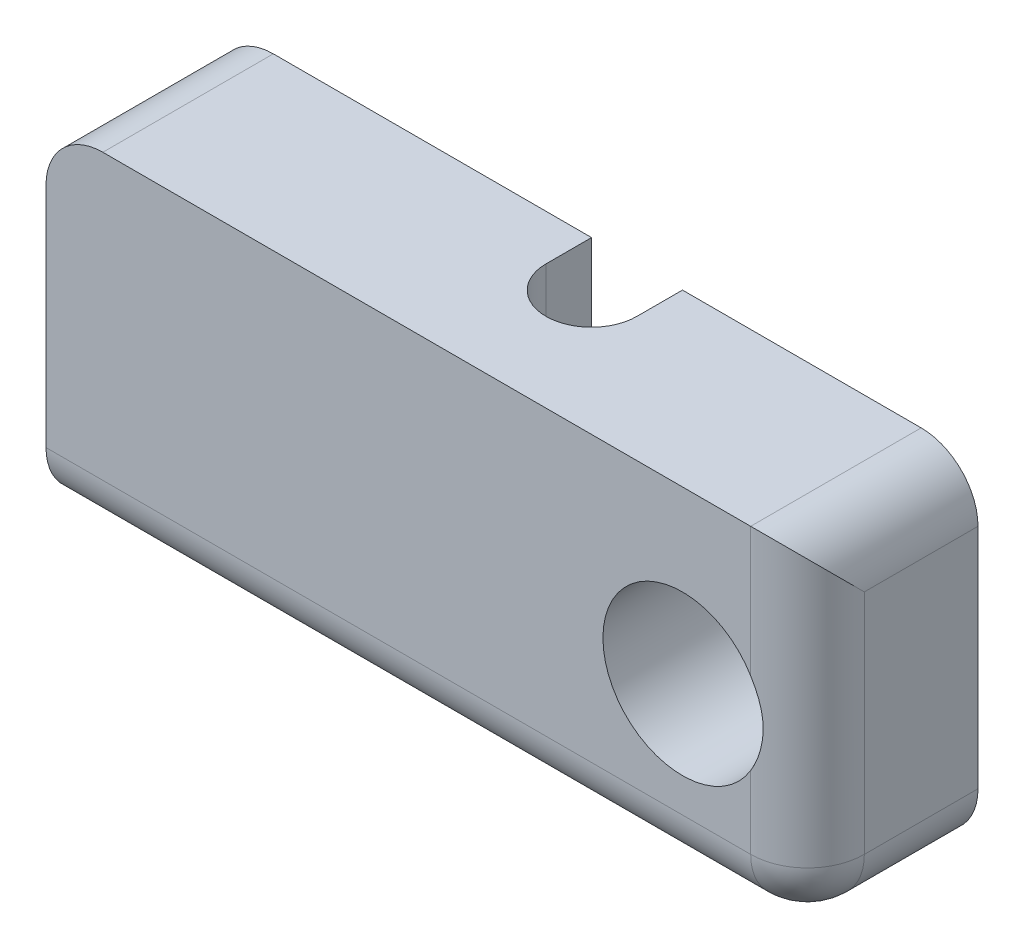
ISO-10303-21;
HEADER;
FILE_DESCRIPTION(('STEP AP214'),'2;1');
FILE_NAME('part.step','',(''),(''),'','','');
FILE_SCHEMA(('AUTOMOTIVE_DESIGN { 1 0 10303 214 1 1 1 1 }'));
ENDSEC;
DATA;
#1=APPLICATION_CONTEXT('core data for automotive mechanical design processes');
#2=APPLICATION_PROTOCOL_DEFINITION('international standard','automotive_design',2000,#1);
#3=PRODUCT_CONTEXT('',#1,'mechanical');
#4=PRODUCT('Part','Part','',(#3));
#5=PRODUCT_RELATED_PRODUCT_CATEGORY('part','',(#4));
#6=PRODUCT_DEFINITION_FORMATION('','',#4);
#7=PRODUCT_DEFINITION_CONTEXT('part definition',#1,'design');
#8=PRODUCT_DEFINITION('design','',#6,#7);
#9=PRODUCT_DEFINITION_SHAPE('','',#8);
#10=(LENGTH_UNIT() NAMED_UNIT(*) SI_UNIT(.MILLI.,.METRE.));
#11=(NAMED_UNIT(*) PLANE_ANGLE_UNIT() SI_UNIT($,.RADIAN.));
#12=(NAMED_UNIT(*) SI_UNIT($,.STERADIAN.) SOLID_ANGLE_UNIT());
#13=UNCERTAINTY_MEASURE_WITH_UNIT(LENGTH_MEASURE(1.E-05),#10,'distance_accuracy_value','');
#14=(GEOMETRIC_REPRESENTATION_CONTEXT(3) GLOBAL_UNCERTAINTY_ASSIGNED_CONTEXT((#13)) GLOBAL_UNIT_ASSIGNED_CONTEXT((#10,
#11,#12)) REPRESENTATION_CONTEXT('',''));
#15=CARTESIAN_POINT('',(0.,0.,0.));
#16=DIRECTION('',(0.,0.,1.));
#17=DIRECTION('',(1.,0.,0.));
#18=AXIS2_PLACEMENT_3D('',#15,#16,#17);
#19=CARTESIAN_POINT('',(-34.2895910701337,-14.94155,3.81));
#20=DIRECTION('',(0.,1.,0.));
#21=DIRECTION('',(0.,0.,1.));
#22=AXIS2_PLACEMENT_3D('',#19,#20,#21);
#23=PLANE('',#22);
#24=DIRECTION('',(0.,0.,-1.));
#25=VECTOR('',#24,1.);
#26=CARTESIAN_POINT('',(-23.8756037701337,-14.94155,0.));
#27=LINE('',#26,#25);
#28=CARTESIAN_POINT('',(-23.8756037701337,-14.94155,1.01854));
#29=VERTEX_POINT('',#28);
#30=CARTESIAN_POINT('',(-23.8756037701337,-14.94155,0.));
#31=VERTEX_POINT('',#30);
#32=EDGE_CURVE('E237',#29,#31,#27,.T.);
#33=ORIENTED_EDGE('',*,*,#32,.T.);
#34=DIRECTION('',(1.,0.,0.));
#35=VECTOR('',#34,1.);
#36=CARTESIAN_POINT('',(-34.2895910701337,-14.94155,0.));
#37=LINE('',#36,#35);
#38=CARTESIAN_POINT('',(-18.5415910701337,-14.94155,0.));
#39=VERTEX_POINT('',#38);
#40=EDGE_CURVE('E175',#31,#39,#37,.T.);
#41=ORIENTED_EDGE('',*,*,#40,.T.);
#42=DIRECTION('',(0.,0.,-1.));
#43=VECTOR('',#42,1.);
#44=CARTESIAN_POINT('',(-18.5415910701337,-14.94155,3.81));
#45=LINE('',#44,#43);
#46=CARTESIAN_POINT('',(-18.5415910701337,-14.94155,2.54));
#47=VERTEX_POINT('',#46);
#48=EDGE_CURVE('E156',#39,#47,#45,.F.);
#49=ORIENTED_EDGE('',*,*,#48,.T.);
#50=DIRECTION('',(1.,0.,0.));
#51=VECTOR('',#50,1.);
#52=CARTESIAN_POINT('',(-34.2895910701337,-14.94155,2.54));
#53=LINE('',#52,#51);
#54=CARTESIAN_POINT('',(-34.2895910701337,-14.94155,2.54));
#55=VERTEX_POINT('',#54);
#56=EDGE_CURVE('E158',#47,#55,#53,.F.);
#57=ORIENTED_EDGE('',*,*,#56,.T.);
#58=DIRECTION('',(0.,0.,-1.));
#59=VECTOR('',#58,1.);
#60=CARTESIAN_POINT('',(-34.2895910701337,-14.94155,3.81));
#61=LINE('',#60,#59);
#62=CARTESIAN_POINT('',(-34.2895910701337,-14.94155,0.));
#63=VERTEX_POINT('',#62);
#64=EDGE_CURVE('E197',#55,#63,#61,.T.);
#65=ORIENTED_EDGE('',*,*,#64,.T.);
#66=CARTESIAN_POINT('',(-25.9075783701337,-14.94155,0.));
#67=VERTEX_POINT('',#66);
#68=EDGE_CURVE('E182',#63,#67,#37,.T.);
#69=ORIENTED_EDGE('',*,*,#68,.T.);
#70=DIRECTION('',(0.,0.,-1.));
#71=VECTOR('',#70,1.);
#72=CARTESIAN_POINT('',(-25.9075783701337,-14.94155,0.));
#73=LINE('',#72,#71);
#74=CARTESIAN_POINT('',(-25.9075783701337,-14.94155,1.01854));
#75=VERTEX_POINT('',#74);
#76=EDGE_CURVE('E56',#75,#67,#73,.T.);
#77=ORIENTED_EDGE('',*,*,#76,.F.);
#78=CARTESIAN_POINT('',(-24.8915910701337,-14.94155,1.01854));
#79=DIRECTION('',(0.,-1.,0.));
#80=DIRECTION('',(0.,0.,-1.));
#81=AXIS2_PLACEMENT_3D('',#78,#79,#80);
#82=CIRCLE('',#81,1.0159873);
#83=EDGE_CURVE('E239',#29,#75,#82,.T.);
#84=ORIENTED_EDGE('',*,*,#83,.F.);
#85=EDGE_LOOP('',(#33,#41,#49,#57,#65,#69,#77,#84));
#86=FACE_BOUND('',#85,.T.);
#87=ADVANCED_FACE('F32',(#86),#23,.F.);
#88=CARTESIAN_POINT('',(-34.2895910701337,-7.32155000000004,3.81));
#89=DIRECTION('',(0.,-1.,0.));
#90=DIRECTION('',(1.,0.,0.));
#91=AXIS2_PLACEMENT_3D('',#88,#89,#90);
#92=PLANE('',#91);
#93=DIRECTION('',(0.,0.,1.));
#94=VECTOR('',#93,1.);
#95=CARTESIAN_POINT('',(-23.8756037701337,-7.32155000000004,0.));
#96=LINE('',#95,#94);
#97=CARTESIAN_POINT('',(-23.8756037701337,-7.32155000000004,0.));
#98=VERTEX_POINT('',#97);
#99=CARTESIAN_POINT('',(-23.8756037701337,-7.32155000000004,1.01854));
#100=VERTEX_POINT('',#99);
#101=EDGE_CURVE('E241',#98,#100,#96,.T.);
#102=ORIENTED_EDGE('',*,*,#101,.T.);
#103=CARTESIAN_POINT('',(-24.8915910701337,-7.32155000000004,1.01854));
#104=DIRECTION('',(0.,-1.,0.));
#105=DIRECTION('',(1.,0.,0.));
#106=AXIS2_PLACEMENT_3D('',#103,#104,#105);
#107=CIRCLE('',#106,1.0159873);
#108=CARTESIAN_POINT('',(-25.9075783701337,-7.32155000000004,1.01854));
#109=VERTEX_POINT('',#108);
#110=EDGE_CURVE('E166',#109,#100,#107,.F.);
#111=ORIENTED_EDGE('',*,*,#110,.F.);
#112=DIRECTION('',(0.,0.,1.));
#113=VECTOR('',#112,1.);
#114=CARTESIAN_POINT('',(-25.9075783701337,-7.32155000000004,0.));
#115=LINE('',#114,#113);
#116=CARTESIAN_POINT('',(-25.9075783701337,-7.32155000000004,0.));
#117=VERTEX_POINT('',#116);
#118=EDGE_CURVE('E244',#117,#109,#115,.T.);
#119=ORIENTED_EDGE('',*,*,#118,.F.);
#120=DIRECTION('',(-1.,0.,0.));
#121=VECTOR('',#120,1.);
#122=CARTESIAN_POINT('',(-34.2895910701337,-7.32155000000004,0.));
#123=LINE('',#122,#121);
#124=CARTESIAN_POINT('',(-33.0195910701337,-7.32155000000004,0.));
#125=VERTEX_POINT('',#124);
#126=EDGE_CURVE('E192',#117,#125,#123,.T.);
#127=ORIENTED_EDGE('',*,*,#126,.T.);
#128=DIRECTION('',(0.,0.,-1.));
#129=VECTOR('',#128,1.);
#130=CARTESIAN_POINT('',(-33.0195910701337,-7.32155000000004,3.81));
#131=LINE('',#130,#129);
#132=CARTESIAN_POINT('',(-33.0195910701337,-7.32155000000004,3.81));
#133=VERTEX_POINT('',#132);
#134=EDGE_CURVE('E146',#125,#133,#131,.F.);
#135=ORIENTED_EDGE('',*,*,#134,.T.);
#136=DIRECTION('',(-1.,0.,0.));
#137=VECTOR('',#136,1.);
#138=CARTESIAN_POINT('',(-34.2895910701337,-7.32155000000004,3.81));
#139=LINE('',#138,#137);
#140=CARTESIAN_POINT('',(-18.5415910701337,-7.32155000000004,3.81));
#141=VERTEX_POINT('',#140);
#142=EDGE_CURVE('E185',#141,#133,#139,.T.);
#143=ORIENTED_EDGE('',*,*,#142,.F.);
#144=DIRECTION('',(0.,0.,-1.));
#145=VECTOR('',#144,1.);
#146=CARTESIAN_POINT('',(-18.5415910701337,-7.32155000000004,3.81));
#147=LINE('',#146,#145);
#148=CARTESIAN_POINT('',(-18.5415910701337,-7.32155000000004,0.));
#149=VERTEX_POINT('',#148);
#150=EDGE_CURVE('E149',#141,#149,#147,.T.);
#151=ORIENTED_EDGE('',*,*,#150,.T.);
#152=EDGE_CURVE('E193',#149,#98,#123,.T.);
#153=ORIENTED_EDGE('',*,*,#152,.T.);
#154=EDGE_LOOP('',(#102,#111,#119,#127,#135,#143,#151,#153));
#155=FACE_BOUND('',#154,.T.);
#156=ADVANCED_FACE('F214',(#155),#92,.F.);
#157=CARTESIAN_POINT('',(0.,0.,0.));
#158=DIRECTION('',(0.,0.,1.));
#159=DIRECTION('',(1.,0.,0.));
#160=AXIS2_PLACEMENT_3D('',#157,#158,#159);
#161=PLANE('',#160);
#162=CARTESIAN_POINT('',(-20.0655910701337,-11.13155,0.));
#163=DIRECTION('',(0.,0.,1.));
#164=DIRECTION('',(1.,0.,0.));
#165=AXIS2_PLACEMENT_3D('',#162,#163,#164);
#166=CIRCLE('',#165,1.778);
#167=CARTESIAN_POINT('',(-18.2875910701337,-11.13155,0.));
#168=VERTEX_POINT('',#167);
#169=EDGE_CURVE('E140',#168,#168,#166,.F.);
#170=ORIENTED_EDGE('',*,*,#169,.F.);
#171=EDGE_LOOP('',(#170));
#172=FACE_BOUND('',#171,.T.);
#173=DIRECTION('',(0.,-1.,0.));
#174=VECTOR('',#173,1.);
#175=CARTESIAN_POINT('',(-23.8756037701337,-7.32055000000004,0.));
#176=LINE('',#175,#174);
#177=EDGE_CURVE('E222',#98,#31,#176,.T.);
#178=ORIENTED_EDGE('',*,*,#177,.F.);
#179=ORIENTED_EDGE('',*,*,#152,.F.);
#180=CARTESIAN_POINT('',(-18.5415910701337,-8.59155000000004,0.));
#181=DIRECTION('',(0.,0.,1.));
#182=DIRECTION('',(1.,0.,0.));
#183=AXIS2_PLACEMENT_3D('',#180,#181,#182);
#184=CIRCLE('',#183,1.27);
#185=CARTESIAN_POINT('',(-17.2715910701337,-8.59155000000004,0.));
#186=VERTEX_POINT('',#185);
#187=EDGE_CURVE('E203',#149,#186,#184,.F.);
#188=ORIENTED_EDGE('',*,*,#187,.T.);
#189=DIRECTION('',(0.,1.,0.));
#190=VECTOR('',#189,1.);
#191=CARTESIAN_POINT('',(-17.2715910701337,-7.32155000000004,0.));
#192=LINE('',#191,#190);
#193=CARTESIAN_POINT('',(-17.2715910701337,-13.67155,0.));
#194=VERTEX_POINT('',#193);
#195=EDGE_CURVE('E189',#194,#186,#192,.T.);
#196=ORIENTED_EDGE('',*,*,#195,.F.);
#197=CARTESIAN_POINT('',(-18.5415910701337,-13.67155,0.));
#198=DIRECTION('',(0.,0.,1.));
#199=DIRECTION('',(1.,0.,0.));
#200=AXIS2_PLACEMENT_3D('',#197,#198,#199);
#201=CIRCLE('',#200,1.27);
#202=EDGE_CURVE('E205',#194,#39,#201,.F.);
#203=ORIENTED_EDGE('',*,*,#202,.T.);
#204=ORIENTED_EDGE('',*,*,#40,.F.);
#205=EDGE_LOOP('',(#178,#179,#188,#196,#203,#204));
#206=FACE_BOUND('',#205,.T.);
#207=ADVANCED_FACE('F219',(#172,#206),#161,.F.);
#208=CARTESIAN_POINT('',(-34.2895910701337,-7.32155000000004,3.81));
#209=DIRECTION('',(1.,0.,0.));
#210=DIRECTION('',(0.,0.,-1.));
#211=AXIS2_PLACEMENT_3D('',#208,#209,#210);
#212=PLANE('',#211);
#213=DIRECTION('',(0.,-1.,0.));
#214=VECTOR('',#213,1.);
#215=CARTESIAN_POINT('',(-34.2895910701337,-7.32155000000004,3.81));
#216=LINE('',#215,#214);
#217=CARTESIAN_POINT('',(-34.2895910701337,-8.59155000000004,3.81));
#218=VERTEX_POINT('',#217);
#219=CARTESIAN_POINT('',(-34.2895910701337,-13.67155,3.81));
#220=VERTEX_POINT('',#219);
#221=EDGE_CURVE('E196',#218,#220,#216,.T.);
#222=ORIENTED_EDGE('',*,*,#221,.F.);
#223=DIRECTION('',(0.,0.,-1.));
#224=VECTOR('',#223,1.);
#225=CARTESIAN_POINT('',(-34.2895910701337,-8.59155000000004,3.81));
#226=LINE('',#225,#224);
#227=CARTESIAN_POINT('',(-34.2895910701337,-8.59155000000004,0.));
#228=VERTEX_POINT('',#227);
#229=EDGE_CURVE('E201',#218,#228,#226,.T.);
#230=ORIENTED_EDGE('',*,*,#229,.T.);
#231=DIRECTION('',(0.,-1.,0.));
#232=VECTOR('',#231,1.);
#233=CARTESIAN_POINT('',(-34.2895910701337,-7.32155000000004,0.));
#234=LINE('',#233,#232);
#235=EDGE_CURVE('E173',#228,#63,#234,.T.);
#236=ORIENTED_EDGE('',*,*,#235,.T.);
#237=ORIENTED_EDGE('',*,*,#64,.F.);
#238=CARTESIAN_POINT('',(-34.2895910701337,-13.67155,2.54));
#239=DIRECTION('',(1.,0.,0.));
#240=DIRECTION('',(0.,0.,-1.));
#241=AXIS2_PLACEMENT_3D('',#238,#239,#240);
#242=CIRCLE('',#241,1.27);
#243=EDGE_CURVE('E199',#55,#220,#242,.F.);
#244=ORIENTED_EDGE('',*,*,#243,.T.);
#245=EDGE_LOOP('',(#222,#230,#236,#237,#244));
#246=FACE_BOUND('',#245,.T.);
#247=ADVANCED_FACE('F265',(#246),#212,.F.);
#248=CARTESIAN_POINT('',(-17.2715910701337,-7.32155000000004,3.81));
#249=DIRECTION('',(-1.,0.,0.));
#250=DIRECTION('',(0.,0.,1.));
#251=AXIS2_PLACEMENT_3D('',#248,#249,#250);
#252=PLANE('',#251);
#253=DIRECTION('',(0.,1.,0.));
#254=VECTOR('',#253,1.);
#255=CARTESIAN_POINT('',(-17.2715910701337,-14.94155,2.54));
#256=LINE('',#255,#254);
#257=CARTESIAN_POINT('',(-17.2715910701337,-8.59155000000004,2.54));
#258=VERTEX_POINT('',#257);
#259=CARTESIAN_POINT('',(-17.2715910701337,-13.67155,2.54));
#260=VERTEX_POINT('',#259);
#261=EDGE_CURVE('E41',#258,#260,#256,.F.);
#262=ORIENTED_EDGE('',*,*,#261,.T.);
#263=DIRECTION('',(0.,0.,-1.));
#264=VECTOR('',#263,1.);
#265=CARTESIAN_POINT('',(-17.2715910701337,-13.67155,3.81));
#266=LINE('',#265,#264);
#267=EDGE_CURVE('E11',#260,#194,#266,.T.);
#268=ORIENTED_EDGE('',*,*,#267,.T.);
#269=ORIENTED_EDGE('',*,*,#195,.T.);
#270=DIRECTION('',(0.,0.,-1.));
#271=VECTOR('',#270,1.);
#272=CARTESIAN_POINT('',(-17.2715910701337,-8.59155000000004,3.81));
#273=LINE('',#272,#271);
#274=EDGE_CURVE('E160',#186,#258,#273,.F.);
#275=ORIENTED_EDGE('',*,*,#274,.T.);
#276=EDGE_LOOP('',(#262,#268,#269,#275));
#277=FACE_BOUND('',#276,.T.);
#278=ADVANCED_FACE('F225',(#277),#252,.F.);
#279=CARTESIAN_POINT('',(0.,0.,3.81));
#280=DIRECTION('',(0.,0.,1.));
#281=DIRECTION('',(1.,0.,0.));
#282=AXIS2_PLACEMENT_3D('',#279,#280,#281);
#283=PLANE('',#282);
#284=CARTESIAN_POINT('',(-20.0655910701337,-11.13155,3.81));
#285=DIRECTION('',(0.,0.,1.));
#286=DIRECTION('',(1.,0.,0.));
#287=AXIS2_PLACEMENT_3D('',#284,#285,#286);
#288=CIRCLE('',#287,1.778);
#289=CARTESIAN_POINT('',(-18.5415910701337,-10.2157399760321,3.81));
#290=VERTEX_POINT('',#289);
#291=CARTESIAN_POINT('',(-18.5415910701337,-12.0473600239679,3.81));
#292=VERTEX_POINT('',#291);
#293=EDGE_CURVE('E48',#290,#292,#288,.T.);
#294=ORIENTED_EDGE('',*,*,#293,.F.);
#295=DIRECTION('',(0.,1.,0.));
#296=VECTOR('',#295,1.);
#297=CARTESIAN_POINT('',(-18.5415910701337,-7.32155000000004,3.81));
#298=LINE('',#297,#296);
#299=EDGE_CURVE('E136',#290,#141,#298,.T.);
#300=ORIENTED_EDGE('',*,*,#299,.T.);
#301=ORIENTED_EDGE('',*,*,#142,.T.);
#302=CARTESIAN_POINT('',(-33.0195910701337,-8.59155000000004,3.81));
#303=DIRECTION('',(0.,0.,1.));
#304=DIRECTION('',(1.,0.,0.));
#305=AXIS2_PLACEMENT_3D('',#302,#303,#304);
#306=CIRCLE('',#305,1.27);
#307=EDGE_CURVE('E154',#133,#218,#306,.T.);
#308=ORIENTED_EDGE('',*,*,#307,.T.);
#309=ORIENTED_EDGE('',*,*,#221,.T.);
#310=DIRECTION('',(1.,0.,0.));
#311=VECTOR('',#310,1.);
#312=CARTESIAN_POINT('',(-17.2715910701337,-13.67155,3.81));
#313=LINE('',#312,#311);
#314=CARTESIAN_POINT('',(-18.5415910701337,-13.67155,3.81));
#315=VERTEX_POINT('',#314);
#316=EDGE_CURVE('E148',#220,#315,#313,.T.);
#317=ORIENTED_EDGE('',*,*,#316,.T.);
#318=EDGE_CURVE('E139',#315,#292,#298,.T.);
#319=ORIENTED_EDGE('',*,*,#318,.T.);
#320=EDGE_LOOP('',(#294,#300,#301,#308,#309,#317,#319));
#321=FACE_BOUND('',#320,.T.);
#322=ADVANCED_FACE('F134',(#321),#283,.T.);
#323=ORIENTED_EDGE('',*,*,#126,.F.);
#324=DIRECTION('',(0.,-1.,0.));
#325=VECTOR('',#324,1.);
#326=CARTESIAN_POINT('',(-25.9075783701337,-7.32055000000004,0.));
#327=LINE('',#326,#325);
#328=EDGE_CURVE('E251',#117,#67,#327,.T.);
#329=ORIENTED_EDGE('',*,*,#328,.T.);
#330=ORIENTED_EDGE('',*,*,#68,.F.);
#331=ORIENTED_EDGE('',*,*,#235,.F.);
#332=CARTESIAN_POINT('',(-33.0195910701337,-8.59155000000004,0.));
#333=DIRECTION('',(0.,0.,1.));
#334=DIRECTION('',(1.,0.,0.));
#335=AXIS2_PLACEMENT_3D('',#332,#333,#334);
#336=CIRCLE('',#335,1.27);
#337=EDGE_CURVE('E208',#228,#125,#336,.F.);
#338=ORIENTED_EDGE('',*,*,#337,.T.);
#339=EDGE_LOOP('',(#323,#329,#330,#331,#338));
#340=FACE_BOUND('',#339,.T.);
#341=ADVANCED_FACE('F268',(#340),#161,.F.);
#342=CARTESIAN_POINT('',(-33.0195910701337,-8.59155000000004,3.81));
#343=DIRECTION('',(0.,0.,-1.));
#344=DIRECTION('',(-1.,0.,0.));
#345=AXIS2_PLACEMENT_3D('',#342,#343,#344);
#346=CYLINDRICAL_SURFACE('',#345,1.27);
#347=ORIENTED_EDGE('',*,*,#307,.F.);
#348=ORIENTED_EDGE('',*,*,#134,.F.);
#349=ORIENTED_EDGE('',*,*,#337,.F.);
#350=ORIENTED_EDGE('',*,*,#229,.F.);
#351=EDGE_LOOP('',(#347,#348,#349,#350));
#352=FACE_BOUND('',#351,.T.);
#353=ADVANCED_FACE('F264',(#352),#346,.T.);
#354=CARTESIAN_POINT('',(-18.5415910701337,-8.59155000000004,3.81));
#355=DIRECTION('',(0.,0.,-1.));
#356=DIRECTION('',(-1.,0.,0.));
#357=AXIS2_PLACEMENT_3D('',#354,#355,#356);
#358=CYLINDRICAL_SURFACE('',#357,1.27);
#359=ORIENTED_EDGE('',*,*,#187,.F.);
#360=ORIENTED_EDGE('',*,*,#150,.F.);
#361=CARTESIAN_POINT('',(-18.5415910701337,-8.59155000000004,2.54));
#362=DIRECTION('',(0.,0.707106781186547,-0.707106781186547));
#363=DIRECTION('',(0.,-0.707106781186547,-0.707106781186547));
#364=AXIS2_PLACEMENT_3D('',#361,#362,#363);
#365=ELLIPSE('',#364,1.79605122421383,1.27);
#366=EDGE_CURVE('E36',#258,#141,#365,.F.);
#367=ORIENTED_EDGE('',*,*,#366,.F.);
#368=ORIENTED_EDGE('',*,*,#274,.F.);
#369=EDGE_LOOP('',(#359,#360,#367,#368));
#370=FACE_BOUND('',#369,.T.);
#371=ADVANCED_FACE('F34',(#370),#358,.T.);
#372=CARTESIAN_POINT('',(-18.5415910701337,0.,2.54));
#373=DIRECTION('',(0.,-1.,0.));
#374=DIRECTION('',(0.,0.,-1.));
#375=AXIS2_PLACEMENT_3D('',#372,#373,#374);
#376=CYLINDRICAL_SURFACE('',#375,1.27);
#377=CARTESIAN_POINT('',(-18.5415910701337,-10.2157399760321,3.81));
#378=CARTESIAN_POINT('',(-18.5136674343586,-10.2621942447051,3.80998200859487));
#379=CARTESIAN_POINT('',(-18.4878893303345,-10.3099160338933,3.80907855010636));
#380=CARTESIAN_POINT('',(-18.4408037635493,-10.4074802720162,3.80621889592703));
#381=CARTESIAN_POINT('',(-18.4194956393187,-10.4573224058664,3.80426285615061));
#382=CARTESIAN_POINT('',(-18.3815505628497,-10.5586486377214,3.80001908572485));
#383=CARTESIAN_POINT('',(-18.3649064464347,-10.6101300806664,3.79773187206615));
#384=CARTESIAN_POINT('',(-18.3363738695328,-10.7144021402795,3.79339357262706));
#385=CARTESIAN_POINT('',(-18.3244850020781,-10.7671926445035,3.79134246665062));
#386=CARTESIAN_POINT('',(-18.3063378010475,-10.8692974076159,3.78805180833124));
#387=CARTESIAN_POINT('',(-18.2996982475327,-10.918542518272,3.78675957034961));
#388=CARTESIAN_POINT('',(-18.2905610293526,-11.0174469869353,3.78495210066125));
#389=CARTESIAN_POINT('',(-18.28806469747,-11.0671064730773,3.78443711898549));
#390=CARTESIAN_POINT('',(-18.2872402091072,-11.1664452630252,3.78426951597249));
#391=CARTESIAN_POINT('',(-18.2889104741932,-11.2161245522001,3.78461656807041));
#392=CARTESIAN_POINT('',(-18.2963992003292,-11.3151628052239,3.78611083705654));
#393=CARTESIAN_POINT('',(-18.3022190749984,-11.3645216541267,3.78725832662143));
#394=CARTESIAN_POINT('',(-18.3256960465084,-11.5106338402517,3.79162481942339));
#395=CARTESIAN_POINT('',(-18.349364005584,-11.6064532126605,3.79577194204489));
#396=CARTESIAN_POINT('',(-18.4121710336922,-11.7926989350533,3.80378023809436));
#397=CARTESIAN_POINT('',(-18.4512781239302,-11.8831359905712,3.80764198311485));
#398=CARTESIAN_POINT('',(-18.5115651797826,-11.9959469883267,3.80971898666659));
#399=CARTESIAN_POINT('',(-18.5262574284848,-12.0218505967557,3.80999366242349));
#400=CARTESIAN_POINT('',(-18.5415910701337,-12.0473600239679,3.81));
#401=B_SPLINE_CURVE_WITH_KNOTS('',3,(#377,#378,#379,#380,#381,#382,#383,#384,#385,#386,#387,
#388,#389,#390,#391,#392,#393,#394,#395,#396,#397,#398,#399,#400),.UNSPECIFIED.,.F.,.F.,(4,2,2,
2,2,2,2,2,2,2,2,4),(0.,0.162513346656858,0.325002627527304,0.487240930239008,0.649465345162184,
0.798411282802545,0.947405123775661,1.09634252991784,1.24533069780651,1.54025575880277,
1.83457312507824,1.92387726341272),.UNSPECIFIED.);
#402=EDGE_CURVE('E125',#290,#292,#401,.T.);
#403=ORIENTED_EDGE('',*,*,#402,.T.);
#404=ORIENTED_EDGE('',*,*,#318,.F.);
#405=CARTESIAN_POINT('',(-18.5415910701337,-13.67155,2.54));
#406=DIRECTION('',(0.,-1.,0.));
#407=DIRECTION('',(0.,0.,-1.));
#408=AXIS2_PLACEMENT_3D('',#405,#406,#407);
#409=CIRCLE('',#408,1.27);
#410=EDGE_CURVE('E168',#260,#315,#409,.T.);
#411=ORIENTED_EDGE('',*,*,#410,.F.);
#412=ORIENTED_EDGE('',*,*,#261,.F.);
#413=ORIENTED_EDGE('',*,*,#366,.T.);
#414=ORIENTED_EDGE('',*,*,#299,.F.);
#415=EDGE_LOOP('',(#403,#404,#411,#412,#413,#414));
#416=FACE_BOUND('',#415,.T.);
#417=ADVANCED_FACE('F143',(#416),#376,.T.);
#418=CARTESIAN_POINT('',(-18.5415910701337,-13.67155,3.81));
#419=DIRECTION('',(0.,0.,-1.));
#420=DIRECTION('',(-1.,0.,0.));
#421=AXIS2_PLACEMENT_3D('',#418,#419,#420);
#422=CYLINDRICAL_SURFACE('',#421,1.27);
#423=ORIENTED_EDGE('',*,*,#202,.F.);
#424=ORIENTED_EDGE('',*,*,#267,.F.);
#425=CARTESIAN_POINT('',(-18.5415910701337,-13.67155,2.54));
#426=DIRECTION('',(0.,0.,1.));
#427=DIRECTION('',(1.,0.,0.));
#428=AXIS2_PLACEMENT_3D('',#425,#426,#427);
#429=CIRCLE('',#428,1.27);
#430=EDGE_CURVE('E165',#47,#260,#429,.T.);
#431=ORIENTED_EDGE('',*,*,#430,.F.);
#432=ORIENTED_EDGE('',*,*,#48,.F.);
#433=EDGE_LOOP('',(#423,#424,#431,#432));
#434=FACE_BOUND('',#433,.T.);
#435=ADVANCED_FACE('F230',(#434),#422,.T.);
#436=CARTESIAN_POINT('',(-18.5415910701337,-13.67155,2.54));
#437=DIRECTION('',(0.,0.,1.));
#438=DIRECTION('',(1.,0.,0.));
#439=AXIS2_PLACEMENT_3D('',#436,#437,#438);
#440=SPHERICAL_SURFACE('',#439,1.27);
#441=ORIENTED_EDGE('',*,*,#430,.T.);
#442=ORIENTED_EDGE('',*,*,#410,.T.);
#443=CARTESIAN_POINT('',(-18.5415910701337,-13.67155,2.54));
#444=DIRECTION('',(1.,0.,0.));
#445=DIRECTION('',(0.,0.,-1.));
#446=AXIS2_PLACEMENT_3D('',#443,#444,#445);
#447=CIRCLE('',#446,1.27);
#448=EDGE_CURVE('E163',#47,#315,#447,.F.);
#449=ORIENTED_EDGE('',*,*,#448,.F.);
#450=EDGE_LOOP('',(#441,#442,#449));
#451=FACE_BOUND('',#450,.T.);
#452=ADVANCED_FACE('F272',(#451),#440,.T.);
#453=CARTESIAN_POINT('',(0.,-13.67155,2.54));
#454=DIRECTION('',(-1.,0.,0.));
#455=DIRECTION('',(0.,0.,1.));
#456=AXIS2_PLACEMENT_3D('',#453,#454,#455);
#457=CYLINDRICAL_SURFACE('',#456,1.27);
#458=ORIENTED_EDGE('',*,*,#243,.F.);
#459=ORIENTED_EDGE('',*,*,#56,.F.);
#460=ORIENTED_EDGE('',*,*,#448,.T.);
#461=ORIENTED_EDGE('',*,*,#316,.F.);
#462=EDGE_LOOP('',(#458,#459,#460,#461));
#463=FACE_BOUND('',#462,.T.);
#464=ADVANCED_FACE('F271',(#463),#457,.T.);
#465=CARTESIAN_POINT('',(-23.8756037701337,-7.32055000000004,0.));
#466=DIRECTION('',(-1.,0.,0.));
#467=DIRECTION('',(0.,0.,1.));
#468=AXIS2_PLACEMENT_3D('',#465,#466,#467);
#469=PLANE('',#468);
#470=ORIENTED_EDGE('',*,*,#177,.T.);
#471=ORIENTED_EDGE('',*,*,#32,.F.);
#472=DIRECTION('',(0.,-1.,0.));
#473=VECTOR('',#472,1.);
#474=CARTESIAN_POINT('',(-23.8756037701337,-7.32055000000004,1.01854));
#475=LINE('',#474,#473);
#476=EDGE_CURVE('E249',#100,#29,#475,.T.);
#477=ORIENTED_EDGE('',*,*,#476,.F.);
#478=ORIENTED_EDGE('',*,*,#101,.F.);
#479=EDGE_LOOP('',(#470,#471,#477,#478));
#480=FACE_BOUND('',#479,.T.);
#481=ADVANCED_FACE('F279',(#480),#469,.T.);
#482=CARTESIAN_POINT('',(-25.9075783701337,-7.32055000000004,0.));
#483=DIRECTION('',(-1.,0.,0.));
#484=DIRECTION('',(0.,0.,1.));
#485=AXIS2_PLACEMENT_3D('',#482,#483,#484);
#486=PLANE('',#485);
#487=ORIENTED_EDGE('',*,*,#118,.T.);
#488=DIRECTION('',(0.,-1.,0.));
#489=VECTOR('',#488,1.);
#490=CARTESIAN_POINT('',(-25.9075783701337,-7.32055000000004,1.01854));
#491=LINE('',#490,#489);
#492=EDGE_CURVE('E253',#109,#75,#491,.T.);
#493=ORIENTED_EDGE('',*,*,#492,.T.);
#494=ORIENTED_EDGE('',*,*,#76,.T.);
#495=ORIENTED_EDGE('',*,*,#328,.F.);
#496=EDGE_LOOP('',(#487,#493,#494,#495));
#497=FACE_BOUND('',#496,.T.);
#498=ADVANCED_FACE('F320',(#497),#486,.F.);
#499=CARTESIAN_POINT('',(-24.8915910701337,-7.32055000000004,1.01854));
#500=DIRECTION('',(0.,-1.,0.));
#501=DIRECTION('',(0.,0.,-1.));
#502=AXIS2_PLACEMENT_3D('',#499,#500,#501);
#503=CYLINDRICAL_SURFACE('',#502,1.0159873);
#504=ORIENTED_EDGE('',*,*,#110,.T.);
#505=ORIENTED_EDGE('',*,*,#476,.T.);
#506=ORIENTED_EDGE('',*,*,#83,.T.);
#507=ORIENTED_EDGE('',*,*,#492,.F.);
#508=EDGE_LOOP('',(#504,#505,#506,#507));
#509=FACE_BOUND('',#508,.T.);
#510=ADVANCED_FACE('F319',(#509),#503,.F.);
#511=CARTESIAN_POINT('',(-20.0655910701337,-11.13155,-0.00100000000000013));
#512=DIRECTION('',(0.,0.,1.));
#513=DIRECTION('',(1.,0.,0.));
#514=AXIS2_PLACEMENT_3D('',#511,#512,#513);
#515=CYLINDRICAL_SURFACE('',#514,1.778);
#516=ORIENTED_EDGE('',*,*,#293,.T.);
#517=ORIENTED_EDGE('',*,*,#402,.F.);
#518=EDGE_LOOP('',(#516,#517));
#519=FACE_BOUND('',#518,.T.);
#520=ORIENTED_EDGE('',*,*,#169,.T.);
#521=EDGE_LOOP('',(#520));
#522=FACE_BOUND('',#521,.T.);
#523=ADVANCED_FACE('F126',(#519,#522),#515,.F.);
#524=CLOSED_SHELL('',(#87,#156,#207,#247,#278,#322,#341,#353,#371,#417,#435,#452,#464,#481,#498,
#510,#523));
#525=MANIFOLD_SOLID_BREP('B2',#524);
#526=ADVANCED_BREP_SHAPE_REPRESENTATION('',(#18,#525),#14);
#527=SHAPE_DEFINITION_REPRESENTATION(#9,#526);
ENDSEC;
END-ISO-10303-21;
